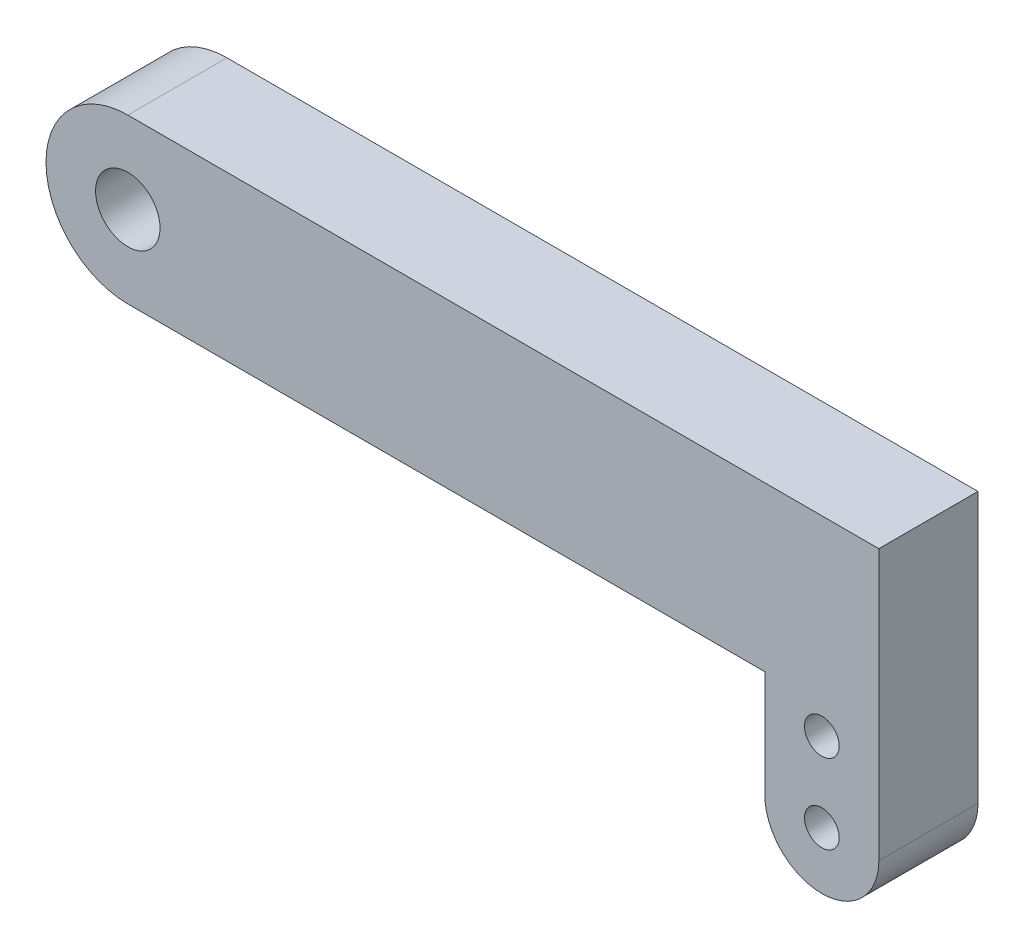
ISO-10303-21;
HEADER;
FILE_DESCRIPTION(('STEP AP214'),'2;1');
FILE_NAME('part.step','',(''),(''),'','','');
FILE_SCHEMA(('AUTOMOTIVE_DESIGN { 1 0 10303 214 1 1 1 1 }'));
ENDSEC;
DATA;
#1=APPLICATION_CONTEXT('core data for automotive mechanical design processes');
#2=APPLICATION_PROTOCOL_DEFINITION('international standard','automotive_design',2000,#1);
#3=PRODUCT_CONTEXT('',#1,'mechanical');
#4=PRODUCT('Part','Part','',(#3));
#5=PRODUCT_RELATED_PRODUCT_CATEGORY('part','',(#4));
#6=PRODUCT_DEFINITION_FORMATION('','',#4);
#7=PRODUCT_DEFINITION_CONTEXT('part definition',#1,'design');
#8=PRODUCT_DEFINITION('design','',#6,#7);
#9=PRODUCT_DEFINITION_SHAPE('','',#8);
#10=(LENGTH_UNIT() NAMED_UNIT(*) SI_UNIT(.MILLI.,.METRE.));
#11=(NAMED_UNIT(*) PLANE_ANGLE_UNIT() SI_UNIT($,.RADIAN.));
#12=(NAMED_UNIT(*) SI_UNIT($,.STERADIAN.) SOLID_ANGLE_UNIT());
#13=UNCERTAINTY_MEASURE_WITH_UNIT(LENGTH_MEASURE(1.E-05),#10,'distance_accuracy_value','');
#14=(GEOMETRIC_REPRESENTATION_CONTEXT(3) GLOBAL_UNCERTAINTY_ASSIGNED_CONTEXT((#13)) GLOBAL_UNIT_ASSIGNED_CONTEXT((#10,
#11,#12)) REPRESENTATION_CONTEXT('',''));
#15=CARTESIAN_POINT('',(0.,0.,0.));
#16=DIRECTION('',(0.,0.,1.));
#17=DIRECTION('',(1.,0.,0.));
#18=AXIS2_PLACEMENT_3D('',#15,#16,#17);
#19=CARTESIAN_POINT('',(0.,0.,10.));
#20=DIRECTION('',(0.,0.,1.));
#21=DIRECTION('',(1.,0.,0.));
#22=AXIS2_PLACEMENT_3D('',#19,#20,#21);
#23=PLANE('',#22);
#24=CARTESIAN_POINT('',(70.,-11.,10.));
#25=DIRECTION('',(0.,0.,1.));
#26=DIRECTION('',(1.,0.,0.));
#27=AXIS2_PLACEMENT_3D('',#24,#25,#26);
#28=CIRCLE('',#27,1.75);
#29=CARTESIAN_POINT('',(71.75,-11.,10.));
#30=VERTEX_POINT('',#29);
#31=EDGE_CURVE('E183',#30,#30,#28,.T.);
#32=ORIENTED_EDGE('',*,*,#31,.F.);
#33=EDGE_LOOP('',(#32));
#34=FACE_BOUND('',#33,.T.);
#35=DIRECTION('',(0.,1.,0.));
#36=VECTOR('',#35,1.);
#37=CARTESIAN_POINT('',(75.75,-19.,10.));
#38=LINE('',#37,#36);
#39=CARTESIAN_POINT('',(75.75,-19.,10.));
#40=VERTEX_POINT('',#39);
#41=CARTESIAN_POINT('',(75.75,8.25000000000001,10.));
#42=VERTEX_POINT('',#41);
#43=EDGE_CURVE('E127',#40,#42,#38,.T.);
#44=ORIENTED_EDGE('',*,*,#43,.T.);
#45=DIRECTION('',(-1.,0.,0.));
#46=VECTOR('',#45,1.);
#47=CARTESIAN_POINT('',(75.75,8.25000000000001,10.));
#48=LINE('',#47,#46);
#49=CARTESIAN_POINT('',(0.,8.25,10.));
#50=VERTEX_POINT('',#49);
#51=EDGE_CURVE('E85',#42,#50,#48,.T.);
#52=ORIENTED_EDGE('',*,*,#51,.T.);
#53=CARTESIAN_POINT('',(0.,0.,10.));
#54=DIRECTION('',(0.,0.,1.));
#55=DIRECTION('',(1.,0.,0.));
#56=AXIS2_PLACEMENT_3D('',#53,#54,#55);
#57=CIRCLE('',#56,8.25);
#58=CARTESIAN_POINT('',(0.,-8.25,10.));
#59=VERTEX_POINT('',#58);
#60=EDGE_CURVE('E98',#50,#59,#57,.T.);
#61=ORIENTED_EDGE('',*,*,#60,.T.);
#62=DIRECTION('',(1.,0.,0.));
#63=VECTOR('',#62,1.);
#64=CARTESIAN_POINT('',(0.,-8.25,10.));
#65=LINE('',#64,#63);
#66=CARTESIAN_POINT('',(64.25,-8.25,10.));
#67=VERTEX_POINT('',#66);
#68=EDGE_CURVE('E92',#59,#67,#65,.T.);
#69=ORIENTED_EDGE('',*,*,#68,.T.);
#70=DIRECTION('',(0.,-1.,0.));
#71=VECTOR('',#70,1.);
#72=CARTESIAN_POINT('',(64.25,-8.25,10.));
#73=LINE('',#72,#71);
#74=CARTESIAN_POINT('',(64.25,-19.,10.));
#75=VERTEX_POINT('',#74);
#76=EDGE_CURVE('E96',#67,#75,#73,.T.);
#77=ORIENTED_EDGE('',*,*,#76,.T.);
#78=CARTESIAN_POINT('',(70.,-19.,10.));
#79=DIRECTION('',(0.,0.,1.));
#80=DIRECTION('',(1.,0.,0.));
#81=AXIS2_PLACEMENT_3D('',#78,#79,#80);
#82=CIRCLE('',#81,5.75000000000001);
#83=EDGE_CURVE('E48',#75,#40,#82,.T.);
#84=ORIENTED_EDGE('',*,*,#83,.T.);
#85=EDGE_LOOP('',(#44,#52,#61,#69,#77,#84));
#86=FACE_BOUND('',#85,.T.);
#87=CARTESIAN_POINT('',(0.,0.,10.));
#88=DIRECTION('',(0.,0.,1.));
#89=DIRECTION('',(1.,0.,0.));
#90=AXIS2_PLACEMENT_3D('',#87,#88,#89);
#91=CIRCLE('',#90,3.25);
#92=CARTESIAN_POINT('',(3.25,0.,10.));
#93=VERTEX_POINT('',#92);
#94=EDGE_CURVE('E120',#93,#93,#91,.T.);
#95=ORIENTED_EDGE('',*,*,#94,.F.);
#96=EDGE_LOOP('',(#95));
#97=FACE_BOUND('',#96,.T.);
#98=CARTESIAN_POINT('',(70.,-19.,10.));
#99=DIRECTION('',(0.,0.,1.));
#100=DIRECTION('',(1.,0.,0.));
#101=AXIS2_PLACEMENT_3D('',#98,#99,#100);
#102=CIRCLE('',#101,1.75);
#103=CARTESIAN_POINT('',(71.75,-19.,10.));
#104=VERTEX_POINT('',#103);
#105=EDGE_CURVE('E174',#104,#104,#102,.T.);
#106=ORIENTED_EDGE('',*,*,#105,.F.);
#107=EDGE_LOOP('',(#106));
#108=FACE_BOUND('',#107,.T.);
#109=ADVANCED_FACE('F31',(#34,#86,#97,#108),#23,.T.);
#110=CARTESIAN_POINT('',(0.,0.,0.));
#111=DIRECTION('',(0.,0.,1.));
#112=DIRECTION('',(1.,0.,0.));
#113=AXIS2_PLACEMENT_3D('',#110,#111,#112);
#114=PLANE('',#113);
#115=CARTESIAN_POINT('',(70.,-11.,0.));
#116=DIRECTION('',(0.,0.,1.));
#117=DIRECTION('',(1.,0.,0.));
#118=AXIS2_PLACEMENT_3D('',#115,#116,#117);
#119=CIRCLE('',#118,1.75);
#120=CARTESIAN_POINT('',(71.75,-11.,0.));
#121=VERTEX_POINT('',#120);
#122=EDGE_CURVE('E180',#121,#121,#119,.T.);
#123=ORIENTED_EDGE('',*,*,#122,.T.);
#124=EDGE_LOOP('',(#123));
#125=FACE_BOUND('',#124,.T.);
#126=DIRECTION('',(0.,1.,0.));
#127=VECTOR('',#126,1.);
#128=CARTESIAN_POINT('',(75.75,-19.,0.));
#129=LINE('',#128,#127);
#130=CARTESIAN_POINT('',(75.75,-19.,0.));
#131=VERTEX_POINT('',#130);
#132=CARTESIAN_POINT('',(75.75,8.25000000000001,0.));
#133=VERTEX_POINT('',#132);
#134=EDGE_CURVE('E116',#131,#133,#129,.T.);
#135=ORIENTED_EDGE('',*,*,#134,.F.);
#136=CARTESIAN_POINT('',(70.,-19.,0.));
#137=DIRECTION('',(0.,0.,1.));
#138=DIRECTION('',(1.,0.,0.));
#139=AXIS2_PLACEMENT_3D('',#136,#137,#138);
#140=CIRCLE('',#139,5.75000000000001);
#141=CARTESIAN_POINT('',(64.25,-19.,0.));
#142=VERTEX_POINT('',#141);
#143=EDGE_CURVE('E77',#142,#131,#140,.T.);
#144=ORIENTED_EDGE('',*,*,#143,.F.);
#145=DIRECTION('',(0.,-1.,0.));
#146=VECTOR('',#145,1.);
#147=CARTESIAN_POINT('',(64.25,-8.25,0.));
#148=LINE('',#147,#146);
#149=CARTESIAN_POINT('',(64.25,-8.25,0.));
#150=VERTEX_POINT('',#149);
#151=EDGE_CURVE('E71',#150,#142,#148,.T.);
#152=ORIENTED_EDGE('',*,*,#151,.F.);
#153=DIRECTION('',(1.,0.,0.));
#154=VECTOR('',#153,1.);
#155=CARTESIAN_POINT('',(0.,-8.25,0.));
#156=LINE('',#155,#154);
#157=CARTESIAN_POINT('',(0.,-8.25,0.));
#158=VERTEX_POINT('',#157);
#159=EDGE_CURVE('E106',#158,#150,#156,.T.);
#160=ORIENTED_EDGE('',*,*,#159,.F.);
#161=CARTESIAN_POINT('',(0.,0.,0.));
#162=DIRECTION('',(0.,0.,1.));
#163=DIRECTION('',(1.,0.,0.));
#164=AXIS2_PLACEMENT_3D('',#161,#162,#163);
#165=CIRCLE('',#164,8.25);
#166=CARTESIAN_POINT('',(0.,8.25,0.));
#167=VERTEX_POINT('',#166);
#168=EDGE_CURVE('E122',#167,#158,#165,.T.);
#169=ORIENTED_EDGE('',*,*,#168,.F.);
#170=DIRECTION('',(-1.,0.,0.));
#171=VECTOR('',#170,1.);
#172=CARTESIAN_POINT('',(75.75,8.25000000000001,0.));
#173=LINE('',#172,#171);
#174=EDGE_CURVE('E119',#133,#167,#173,.T.);
#175=ORIENTED_EDGE('',*,*,#174,.F.);
#176=EDGE_LOOP('',(#135,#144,#152,#160,#169,#175));
#177=FACE_BOUND('',#176,.T.);
#178=CARTESIAN_POINT('',(0.,0.,0.));
#179=DIRECTION('',(0.,0.,1.));
#180=DIRECTION('',(1.,0.,0.));
#181=AXIS2_PLACEMENT_3D('',#178,#179,#180);
#182=CIRCLE('',#181,3.25);
#183=CARTESIAN_POINT('',(3.25,0.,0.));
#184=VERTEX_POINT('',#183);
#185=EDGE_CURVE('E186',#184,#184,#182,.T.);
#186=ORIENTED_EDGE('',*,*,#185,.T.);
#187=EDGE_LOOP('',(#186));
#188=FACE_BOUND('',#187,.T.);
#189=CARTESIAN_POINT('',(70.,-19.,0.));
#190=DIRECTION('',(0.,0.,1.));
#191=DIRECTION('',(1.,0.,0.));
#192=AXIS2_PLACEMENT_3D('',#189,#190,#191);
#193=CIRCLE('',#192,1.75);
#194=CARTESIAN_POINT('',(71.75,-19.,0.));
#195=VERTEX_POINT('',#194);
#196=EDGE_CURVE('E177',#195,#195,#193,.T.);
#197=ORIENTED_EDGE('',*,*,#196,.T.);
#198=EDGE_LOOP('',(#197));
#199=FACE_BOUND('',#198,.T.);
#200=ADVANCED_FACE('F136',(#125,#177,#188,#199),#114,.F.);
#201=CARTESIAN_POINT('',(75.75,-19.,10.));
#202=DIRECTION('',(-1.,0.,0.));
#203=DIRECTION('',(0.,0.,1.));
#204=AXIS2_PLACEMENT_3D('',#201,#202,#203);
#205=PLANE('',#204);
#206=ORIENTED_EDGE('',*,*,#134,.T.);
#207=DIRECTION('',(0.,0.,-1.));
#208=VECTOR('',#207,1.);
#209=CARTESIAN_POINT('',(75.75,8.25000000000001,10.));
#210=LINE('',#209,#208);
#211=EDGE_CURVE('E11',#42,#133,#210,.T.);
#212=ORIENTED_EDGE('',*,*,#211,.F.);
#213=ORIENTED_EDGE('',*,*,#43,.F.);
#214=DIRECTION('',(0.,0.,-1.));
#215=VECTOR('',#214,1.);
#216=CARTESIAN_POINT('',(75.75,-19.,10.));
#217=LINE('',#216,#215);
#218=EDGE_CURVE('E112',#40,#131,#217,.T.);
#219=ORIENTED_EDGE('',*,*,#218,.T.);
#220=EDGE_LOOP('',(#206,#212,#213,#219));
#221=FACE_BOUND('',#220,.T.);
#222=ADVANCED_FACE('F33',(#221),#205,.F.);
#223=CARTESIAN_POINT('',(75.75,8.25000000000001,10.));
#224=DIRECTION('',(0.,-1.,0.));
#225=DIRECTION('',(1.,0.,0.));
#226=AXIS2_PLACEMENT_3D('',#223,#224,#225);
#227=PLANE('',#226);
#228=ORIENTED_EDGE('',*,*,#174,.T.);
#229=DIRECTION('',(0.,0.,-1.));
#230=VECTOR('',#229,1.);
#231=CARTESIAN_POINT('',(0.,8.25,10.));
#232=LINE('',#231,#230);
#233=EDGE_CURVE('E40',#50,#167,#232,.T.);
#234=ORIENTED_EDGE('',*,*,#233,.F.);
#235=ORIENTED_EDGE('',*,*,#51,.F.);
#236=ORIENTED_EDGE('',*,*,#211,.T.);
#237=EDGE_LOOP('',(#228,#234,#235,#236));
#238=FACE_BOUND('',#237,.T.);
#239=ADVANCED_FACE('F235',(#238),#227,.F.);
#240=CARTESIAN_POINT('',(0.,0.,10.));
#241=DIRECTION('',(0.,0.,-1.));
#242=DIRECTION('',(-1.,0.,0.));
#243=AXIS2_PLACEMENT_3D('',#240,#241,#242);
#244=CYLINDRICAL_SURFACE('',#243,8.25);
#245=ORIENTED_EDGE('',*,*,#168,.T.);
#246=DIRECTION('',(0.,0.,-1.));
#247=VECTOR('',#246,1.);
#248=CARTESIAN_POINT('',(0.,-8.25,10.));
#249=LINE('',#248,#247);
#250=EDGE_CURVE('E107',#59,#158,#249,.T.);
#251=ORIENTED_EDGE('',*,*,#250,.F.);
#252=ORIENTED_EDGE('',*,*,#60,.F.);
#253=ORIENTED_EDGE('',*,*,#233,.T.);
#254=EDGE_LOOP('',(#245,#251,#252,#253));
#255=FACE_BOUND('',#254,.T.);
#256=ADVANCED_FACE('F133',(#255),#244,.T.);
#257=CARTESIAN_POINT('',(0.,-8.25,10.));
#258=DIRECTION('',(0.,1.,0.));
#259=DIRECTION('',(0.,0.,1.));
#260=AXIS2_PLACEMENT_3D('',#257,#258,#259);
#261=PLANE('',#260);
#262=ORIENTED_EDGE('',*,*,#159,.T.);
#263=DIRECTION('',(0.,0.,-1.));
#264=VECTOR('',#263,1.);
#265=CARTESIAN_POINT('',(64.25,-8.25,10.));
#266=LINE('',#265,#264);
#267=EDGE_CURVE('E103',#67,#150,#266,.T.);
#268=ORIENTED_EDGE('',*,*,#267,.F.);
#269=ORIENTED_EDGE('',*,*,#68,.F.);
#270=ORIENTED_EDGE('',*,*,#250,.T.);
#271=EDGE_LOOP('',(#262,#268,#269,#270));
#272=FACE_BOUND('',#271,.T.);
#273=ADVANCED_FACE('F104',(#272),#261,.F.);
#274=CARTESIAN_POINT('',(64.25,-8.25,10.));
#275=DIRECTION('',(1.,0.,0.));
#276=DIRECTION('',(0.,0.,-1.));
#277=AXIS2_PLACEMENT_3D('',#274,#275,#276);
#278=PLANE('',#277);
#279=ORIENTED_EDGE('',*,*,#151,.T.);
#280=DIRECTION('',(0.,0.,-1.));
#281=VECTOR('',#280,1.);
#282=CARTESIAN_POINT('',(64.25,-19.,10.));
#283=LINE('',#282,#281);
#284=EDGE_CURVE('E108',#75,#142,#283,.T.);
#285=ORIENTED_EDGE('',*,*,#284,.F.);
#286=ORIENTED_EDGE('',*,*,#76,.F.);
#287=ORIENTED_EDGE('',*,*,#267,.T.);
#288=EDGE_LOOP('',(#279,#285,#286,#287));
#289=FACE_BOUND('',#288,.T.);
#290=ADVANCED_FACE('F110',(#289),#278,.F.);
#291=CARTESIAN_POINT('',(70.,-19.,10.));
#292=DIRECTION('',(0.,0.,-1.));
#293=DIRECTION('',(-1.,0.,0.));
#294=AXIS2_PLACEMENT_3D('',#291,#292,#293);
#295=CYLINDRICAL_SURFACE('',#294,5.75000000000001);
#296=ORIENTED_EDGE('',*,*,#143,.T.);
#297=ORIENTED_EDGE('',*,*,#218,.F.);
#298=ORIENTED_EDGE('',*,*,#83,.F.);
#299=ORIENTED_EDGE('',*,*,#284,.T.);
#300=EDGE_LOOP('',(#296,#297,#298,#299));
#301=FACE_BOUND('',#300,.T.);
#302=ADVANCED_FACE('F141',(#301),#295,.T.);
#303=CARTESIAN_POINT('',(0.,0.,10.));
#304=DIRECTION('',(0.,0.,-1.));
#305=DIRECTION('',(-1.,0.,0.));
#306=AXIS2_PLACEMENT_3D('',#303,#304,#305);
#307=CYLINDRICAL_SURFACE('',#306,3.25);
#308=ORIENTED_EDGE('',*,*,#94,.T.);
#309=EDGE_LOOP('',(#308));
#310=FACE_BOUND('',#309,.T.);
#311=ORIENTED_EDGE('',*,*,#185,.F.);
#312=EDGE_LOOP('',(#311));
#313=FACE_BOUND('',#312,.T.);
#314=ADVANCED_FACE('F143',(#310,#313),#307,.F.);
#315=CARTESIAN_POINT('',(70.,-11.,10.));
#316=DIRECTION('',(0.,0.,-1.));
#317=DIRECTION('',(-1.,0.,0.));
#318=AXIS2_PLACEMENT_3D('',#315,#316,#317);
#319=CYLINDRICAL_SURFACE('',#318,1.75);
#320=ORIENTED_EDGE('',*,*,#31,.T.);
#321=EDGE_LOOP('',(#320));
#322=FACE_BOUND('',#321,.T.);
#323=ORIENTED_EDGE('',*,*,#122,.F.);
#324=EDGE_LOOP('',(#323));
#325=FACE_BOUND('',#324,.T.);
#326=ADVANCED_FACE('F149',(#322,#325),#319,.F.);
#327=CARTESIAN_POINT('',(70.,-19.,10.));
#328=DIRECTION('',(0.,0.,-1.));
#329=DIRECTION('',(-1.,0.,0.));
#330=AXIS2_PLACEMENT_3D('',#327,#328,#329);
#331=CYLINDRICAL_SURFACE('',#330,1.75);
#332=ORIENTED_EDGE('',*,*,#105,.T.);
#333=EDGE_LOOP('',(#332));
#334=FACE_BOUND('',#333,.T.);
#335=ORIENTED_EDGE('',*,*,#196,.F.);
#336=EDGE_LOOP('',(#335));
#337=FACE_BOUND('',#336,.T.);
#338=ADVANCED_FACE('F165',(#334,#337),#331,.F.);
#339=CLOSED_SHELL('',(#109,#200,#222,#239,#256,#273,#290,#302,#314,#326,#338));
#340=MANIFOLD_SOLID_BREP('B2',#339);
#341=ADVANCED_BREP_SHAPE_REPRESENTATION('',(#18,#340),#14);
#342=SHAPE_DEFINITION_REPRESENTATION(#9,#341);
ENDSEC;
END-ISO-10303-21;
